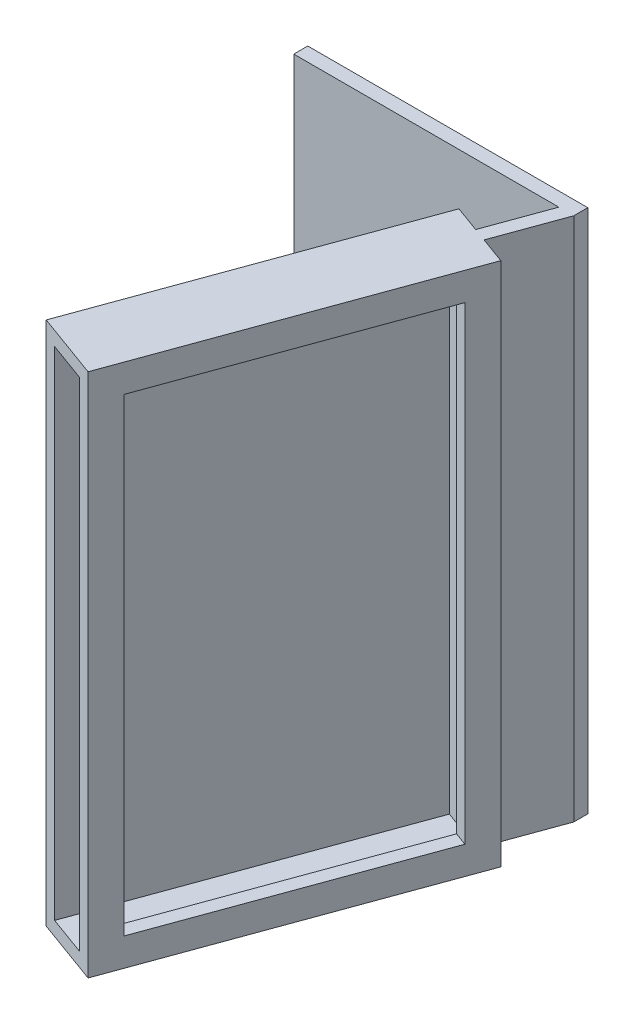
ISO-10303-21;
HEADER;
FILE_DESCRIPTION(('STEP AP214'),'2;1');
FILE_NAME('part.step','',(''),(''),'','','');
FILE_SCHEMA(('AUTOMOTIVE_DESIGN { 1 0 10303 214 1 1 1 1 }'));
ENDSEC;
DATA;
#1=APPLICATION_CONTEXT('core data for automotive mechanical design processes');
#2=APPLICATION_PROTOCOL_DEFINITION('international standard','automotive_design',2000,#1);
#3=PRODUCT_CONTEXT('',#1,'mechanical');
#4=PRODUCT('Part','Part','',(#3));
#5=PRODUCT_RELATED_PRODUCT_CATEGORY('part','',(#4));
#6=PRODUCT_DEFINITION_FORMATION('','',#4);
#7=PRODUCT_DEFINITION_CONTEXT('part definition',#1,'design');
#8=PRODUCT_DEFINITION('design','',#6,#7);
#9=PRODUCT_DEFINITION_SHAPE('','',#8);
#10=(LENGTH_UNIT() NAMED_UNIT(*) SI_UNIT(.MILLI.,.METRE.));
#11=(NAMED_UNIT(*) PLANE_ANGLE_UNIT() SI_UNIT($,.RADIAN.));
#12=(NAMED_UNIT(*) SI_UNIT($,.STERADIAN.) SOLID_ANGLE_UNIT());
#13=UNCERTAINTY_MEASURE_WITH_UNIT(LENGTH_MEASURE(1.E-05),#10,'distance_accuracy_value','');
#14=(GEOMETRIC_REPRESENTATION_CONTEXT(3) GLOBAL_UNCERTAINTY_ASSIGNED_CONTEXT((#13)) GLOBAL_UNIT_ASSIGNED_CONTEXT((#10,
#11,#12)) REPRESENTATION_CONTEXT('',''));
#15=CARTESIAN_POINT('',(0.,0.,0.));
#16=DIRECTION('',(0.,0.,1.));
#17=DIRECTION('',(1.,0.,0.));
#18=AXIS2_PLACEMENT_3D('',#15,#16,#17);
#19=CARTESIAN_POINT('',(0.,0.,2.54));
#20=DIRECTION('',(0.,1.,0.));
#21=DIRECTION('',(0.,0.,1.));
#22=AXIS2_PLACEMENT_3D('',#19,#20,#21);
#23=PLANE('',#22);
#24=DIRECTION('',(1.,0.,0.));
#25=VECTOR('',#24,1.);
#26=CARTESIAN_POINT('',(0.,0.,0.));
#27=LINE('',#26,#25);
#28=CARTESIAN_POINT('',(-50.8,0.,0.));
#29=VERTEX_POINT('',#28);
#30=CARTESIAN_POINT('',(0.,0.,0.));
#31=VERTEX_POINT('',#30);
#32=EDGE_CURVE('E288',#29,#31,#27,.T.);
#33=ORIENTED_EDGE('',*,*,#32,.T.);
#34=DIRECTION('',(0.,0.,-1.));
#35=VECTOR('',#34,1.);
#36=CARTESIAN_POINT('',(0.,0.,2.54));
#37=LINE('',#36,#35);
#38=CARTESIAN_POINT('',(0.,0.,2.54));
#39=VERTEX_POINT('',#38);
#40=EDGE_CURVE('E11',#39,#31,#37,.T.);
#41=ORIENTED_EDGE('',*,*,#40,.F.);
#42=DIRECTION('',(-0.342020143325672,0.,0.939692620785907));
#43=VECTOR('',#42,1.);
#44=CARTESIAN_POINT('',(0.,0.,2.54));
#45=LINE('',#44,#43);
#46=CARTESIAN_POINT('',(-4.34365582023604,0.,14.474096283981));
#47=VERTEX_POINT('',#46);
#48=EDGE_CURVE('E275',#39,#47,#45,.T.);
#49=ORIENTED_EDGE('',*,*,#48,.T.);
#50=DIRECTION('',(0.939692620785908,0.,0.342020143325671));
#51=VECTOR('',#50,1.);
#52=CARTESIAN_POINT('',(-11.5041135906247,0.,11.8679027918394));
#53=LINE('',#52,#51);
#54=CARTESIAN_POINT('',(0.429982693356341,0.,16.2115586120754));
#55=VERTEX_POINT('',#54);
#56=EDGE_CURVE('E248',#47,#55,#53,.T.);
#57=ORIENTED_EDGE('',*,*,#56,.T.);
#58=DIRECTION('',(0.342020143325671,0.,-0.939692620785908));
#59=VECTOR('',#58,1.);
#60=CARTESIAN_POINT('',(-0.438748470690864,0.,18.5983778688716));
#61=LINE('',#60,#59);
#62=CARTESIAN_POINT('',(-19.5508340797293,0.,71.1084015183881));
#63=VERTEX_POINT('',#62);
#64=EDGE_CURVE('E263',#63,#55,#61,.T.);
#65=ORIENTED_EDGE('',*,*,#64,.F.);
#66=DIRECTION('',(0.939692620785907,0.,0.342020143325671));
#67=VECTOR('',#66,1.);
#68=CARTESIAN_POINT('',(-31.4849303637104,0.,66.7647456981521));
#69=LINE('',#68,#67);
#70=CARTESIAN_POINT('',(-31.4849303637104,0.,66.7647456981521));
#71=VERTEX_POINT('',#70);
#72=EDGE_CURVE('E240',#71,#63,#69,.T.);
#73=ORIENTED_EDGE('',*,*,#72,.F.);
#74=DIRECTION('',(0.342020143325671,0.,-0.939692620785908));
#75=VECTOR('',#74,1.);
#76=CARTESIAN_POINT('',(-12.3728447546719,0.,14.2547220486356));
#77=LINE('',#76,#75);
#78=CARTESIAN_POINT('',(-11.5041135906247,0.,11.8679027918394));
#79=VERTEX_POINT('',#78);
#80=EDGE_CURVE('E270',#71,#79,#77,.T.);
#81=ORIENTED_EDGE('',*,*,#80,.T.);
#82=CARTESIAN_POINT('',(-6.73047507703225,0.,13.6053651199338));
#83=VERTEX_POINT('',#82);
#84=EDGE_CURVE('E249',#79,#83,#53,.T.);
#85=ORIENTED_EDGE('',*,*,#84,.T.);
#86=DIRECTION('',(0.342020143325673,0.,-0.939692620785907));
#87=VECTOR('',#86,1.);
#88=CARTESIAN_POINT('',(-6.73047507703224,0.,13.6053651199338));
#89=LINE('',#88,#87);
#90=CARTESIAN_POINT('',(-2.70301154208881,0.,2.54));
#91=VERTEX_POINT('',#90);
#92=EDGE_CURVE('E273',#83,#91,#89,.T.);
#93=ORIENTED_EDGE('',*,*,#92,.T.);
#94=DIRECTION('',(1.,0.,0.));
#95=VECTOR('',#94,1.);
#96=CARTESIAN_POINT('',(0.,0.,2.54));
#97=LINE('',#96,#95);
#98=CARTESIAN_POINT('',(-50.8,0.,2.54));
#99=VERTEX_POINT('',#98);
#100=EDGE_CURVE('E293',#99,#91,#97,.T.);
#101=ORIENTED_EDGE('',*,*,#100,.F.);
#102=DIRECTION('',(0.,0.,-1.));
#103=VECTOR('',#102,1.);
#104=CARTESIAN_POINT('',(-50.8,0.,2.54));
#105=LINE('',#104,#103);
#106=EDGE_CURVE('E301',#99,#29,#105,.T.);
#107=ORIENTED_EDGE('',*,*,#106,.T.);
#108=EDGE_LOOP('',(#33,#41,#49,#57,#65,#73,#81,#85,#93,#101,#107));
#109=FACE_BOUND('',#108,.T.);
#110=ADVANCED_FACE('F39',(#109),#23,.F.);
#111=CARTESIAN_POINT('',(0.,0.,2.54));
#112=DIRECTION('',(-1.,0.,0.));
#113=DIRECTION('',(0.,0.,1.));
#114=AXIS2_PLACEMENT_3D('',#111,#112,#113);
#115=PLANE('',#114);
#116=DIRECTION('',(0.,1.,0.));
#117=VECTOR('',#116,1.);
#118=CARTESIAN_POINT('',(0.,0.,0.));
#119=LINE('',#118,#117);
#120=CARTESIAN_POINT('',(0.,95.25,0.));
#121=VERTEX_POINT('',#120);
#122=EDGE_CURVE('E302',#31,#121,#119,.T.);
#123=ORIENTED_EDGE('',*,*,#122,.T.);
#124=DIRECTION('',(0.,0.,-1.));
#125=VECTOR('',#124,1.);
#126=CARTESIAN_POINT('',(0.,95.25,2.54));
#127=LINE('',#126,#125);
#128=CARTESIAN_POINT('',(0.,95.25,2.54));
#129=VERTEX_POINT('',#128);
#130=EDGE_CURVE('E46',#129,#121,#127,.T.);
#131=ORIENTED_EDGE('',*,*,#130,.F.);
#132=DIRECTION('',(0.,1.,0.));
#133=VECTOR('',#132,1.);
#134=CARTESIAN_POINT('',(0.,0.,2.54));
#135=LINE('',#134,#133);
#136=EDGE_CURVE('E295',#39,#129,#135,.T.);
#137=ORIENTED_EDGE('',*,*,#136,.F.);
#138=ORIENTED_EDGE('',*,*,#40,.T.);
#139=EDGE_LOOP('',(#123,#131,#137,#138));
#140=FACE_BOUND('',#139,.T.);
#141=ADVANCED_FACE('F363',(#140),#115,.F.);
#142=CARTESIAN_POINT('',(0.,95.25,2.54));
#143=DIRECTION('',(0.,-1.,0.));
#144=DIRECTION('',(0.,0.,-1.));
#145=AXIS2_PLACEMENT_3D('',#142,#143,#144);
#146=PLANE('',#145);
#147=DIRECTION('',(-1.,0.,0.));
#148=VECTOR('',#147,1.);
#149=CARTESIAN_POINT('',(0.,95.25,0.));
#150=LINE('',#149,#148);
#151=CARTESIAN_POINT('',(-50.8,95.25,0.));
#152=VERTEX_POINT('',#151);
#153=EDGE_CURVE('E306',#121,#152,#150,.T.);
#154=ORIENTED_EDGE('',*,*,#153,.T.);
#155=DIRECTION('',(0.,0.,-1.));
#156=VECTOR('',#155,1.);
#157=CARTESIAN_POINT('',(-50.8,95.25,2.54));
#158=LINE('',#157,#156);
#159=CARTESIAN_POINT('',(-50.8,95.25,2.54));
#160=VERTEX_POINT('',#159);
#161=EDGE_CURVE('E311',#160,#152,#158,.T.);
#162=ORIENTED_EDGE('',*,*,#161,.F.);
#163=DIRECTION('',(-1.,0.,0.));
#164=VECTOR('',#163,1.);
#165=CARTESIAN_POINT('',(0.,95.25,2.54));
#166=LINE('',#165,#164);
#167=CARTESIAN_POINT('',(-2.70301154208881,95.25,2.54));
#168=VERTEX_POINT('',#167);
#169=EDGE_CURVE('E300',#168,#160,#166,.T.);
#170=ORIENTED_EDGE('',*,*,#169,.F.);
#171=DIRECTION('',(-0.342020143325673,0.,0.939692620785907));
#172=VECTOR('',#171,1.);
#173=CARTESIAN_POINT('',(-6.73047507703224,95.25,13.6053651199338));
#174=LINE('',#173,#172);
#175=CARTESIAN_POINT('',(-6.73047507703224,95.25,13.6053651199338));
#176=VERTEX_POINT('',#175);
#177=EDGE_CURVE('E272',#168,#176,#174,.T.);
#178=ORIENTED_EDGE('',*,*,#177,.T.);
#179=DIRECTION('',(-0.939692620785908,0.,-0.342020143325671));
#180=VECTOR('',#179,1.);
#181=CARTESIAN_POINT('',(-11.5041135906247,95.25,11.8679027918394));
#182=LINE('',#181,#180);
#183=CARTESIAN_POINT('',(-11.5041135906247,95.25,11.8679027918394));
#184=VERTEX_POINT('',#183);
#185=EDGE_CURVE('E253',#176,#184,#182,.T.);
#186=ORIENTED_EDGE('',*,*,#185,.T.);
#187=DIRECTION('',(0.342020143325671,0.,-0.939692620785908));
#188=VECTOR('',#187,1.);
#189=CARTESIAN_POINT('',(-12.3728447546719,95.25,14.2547220486356));
#190=LINE('',#189,#188);
#191=CARTESIAN_POINT('',(-31.4849303637104,95.25,66.7647456981521));
#192=VERTEX_POINT('',#191);
#193=EDGE_CURVE('E256',#192,#184,#190,.T.);
#194=ORIENTED_EDGE('',*,*,#193,.F.);
#195=DIRECTION('',(-0.939692620785907,0.,-0.342020143325671));
#196=VECTOR('',#195,1.);
#197=CARTESIAN_POINT('',(-31.4849303637104,95.25,66.7647456981521));
#198=LINE('',#197,#196);
#199=CARTESIAN_POINT('',(-19.5508340797294,95.25,71.1084015183881));
#200=VERTEX_POINT('',#199);
#201=EDGE_CURVE('E243',#200,#192,#198,.T.);
#202=ORIENTED_EDGE('',*,*,#201,.F.);
#203=DIRECTION('',(0.342020143325671,0.,-0.939692620785908));
#204=VECTOR('',#203,1.);
#205=CARTESIAN_POINT('',(-0.438748470690838,95.25,18.5983778688716));
#206=LINE('',#205,#204);
#207=CARTESIAN_POINT('',(0.429982693356366,95.25,16.2115586120754));
#208=VERTEX_POINT('',#207);
#209=EDGE_CURVE('E265',#200,#208,#206,.T.);
#210=ORIENTED_EDGE('',*,*,#209,.T.);
#211=CARTESIAN_POINT('',(-4.34365582023604,95.25,14.474096283981));
#212=VERTEX_POINT('',#211);
#213=EDGE_CURVE('E257',#208,#212,#182,.T.);
#214=ORIENTED_EDGE('',*,*,#213,.T.);
#215=DIRECTION('',(0.342020143325673,0.,-0.939692620785907));
#216=VECTOR('',#215,1.);
#217=CARTESIAN_POINT('',(0.,95.25,2.54));
#218=LINE('',#217,#216);
#219=EDGE_CURVE('E276',#212,#129,#218,.T.);
#220=ORIENTED_EDGE('',*,*,#219,.T.);
#221=ORIENTED_EDGE('',*,*,#130,.T.);
#222=EDGE_LOOP('',(#154,#162,#170,#178,#186,#194,#202,#210,#214,#220,#221));
#223=FACE_BOUND('',#222,.T.);
#224=ADVANCED_FACE('F320',(#223),#146,.F.);
#225=CARTESIAN_POINT('',(-50.8,0.,2.54));
#226=DIRECTION('',(1.,0.,0.));
#227=DIRECTION('',(0.,0.,-1.));
#228=AXIS2_PLACEMENT_3D('',#225,#226,#227);
#229=PLANE('',#228);
#230=DIRECTION('',(0.,-1.,0.));
#231=VECTOR('',#230,1.);
#232=CARTESIAN_POINT('',(-50.8,0.,0.));
#233=LINE('',#232,#231);
#234=EDGE_CURVE('E294',#152,#29,#233,.T.);
#235=ORIENTED_EDGE('',*,*,#234,.T.);
#236=ORIENTED_EDGE('',*,*,#106,.F.);
#237=DIRECTION('',(0.,-1.,0.));
#238=VECTOR('',#237,1.);
#239=CARTESIAN_POINT('',(-50.8,0.,2.54));
#240=LINE('',#239,#238);
#241=EDGE_CURVE('E299',#160,#99,#240,.T.);
#242=ORIENTED_EDGE('',*,*,#241,.F.);
#243=ORIENTED_EDGE('',*,*,#161,.T.);
#244=EDGE_LOOP('',(#235,#236,#242,#243));
#245=FACE_BOUND('',#244,.T.);
#246=ADVANCED_FACE('F329',(#245),#229,.F.);
#247=CARTESIAN_POINT('',(0.,0.,2.54));
#248=DIRECTION('',(0.,0.,-1.));
#249=DIRECTION('',(-1.,0.,0.));
#250=AXIS2_PLACEMENT_3D('',#247,#248,#249);
#251=PLANE('',#250);
#252=ORIENTED_EDGE('',*,*,#100,.T.);
#253=DIRECTION('',(0.,1.,0.));
#254=VECTOR('',#253,1.);
#255=CARTESIAN_POINT('',(-2.70301154208881,-13.7011659678248,2.54));
#256=LINE('',#255,#254);
#257=EDGE_CURVE('E285',#91,#168,#256,.T.);
#258=ORIENTED_EDGE('',*,*,#257,.T.);
#259=ORIENTED_EDGE('',*,*,#169,.T.);
#260=ORIENTED_EDGE('',*,*,#241,.T.);
#261=EDGE_LOOP('',(#252,#258,#259,#260));
#262=FACE_BOUND('',#261,.T.);
#263=ADVANCED_FACE('F337',(#262),#251,.F.);
#264=CARTESIAN_POINT('',(0.,0.,0.));
#265=DIRECTION('',(0.,0.,-1.));
#266=DIRECTION('',(-1.,0.,0.));
#267=AXIS2_PLACEMENT_3D('',#264,#265,#266);
#268=PLANE('',#267);
#269=ORIENTED_EDGE('',*,*,#32,.F.);
#270=ORIENTED_EDGE('',*,*,#234,.F.);
#271=ORIENTED_EDGE('',*,*,#153,.F.);
#272=ORIENTED_EDGE('',*,*,#122,.F.);
#273=EDGE_LOOP('',(#269,#270,#271,#272));
#274=FACE_BOUND('',#273,.T.);
#275=ADVANCED_FACE('F323',(#274),#268,.T.);
#276=CARTESIAN_POINT('',(0.,-13.7011659678248,2.54));
#277=DIRECTION('',(0.939692620785907,0.,0.342020143325672));
#278=DIRECTION('',(0.342020143325672,0.,-0.939692620785907));
#279=AXIS2_PLACEMENT_3D('',#276,#277,#278);
#280=PLANE('',#279);
#281=ORIENTED_EDGE('',*,*,#48,.F.);
#282=ORIENTED_EDGE('',*,*,#136,.T.);
#283=ORIENTED_EDGE('',*,*,#219,.F.);
#284=DIRECTION('',(0.,1.,0.));
#285=VECTOR('',#284,1.);
#286=CARTESIAN_POINT('',(-4.34365582023604,-13.7011659678248,14.474096283981));
#287=LINE('',#286,#285);
#288=EDGE_CURVE('E277',#47,#212,#287,.T.);
#289=ORIENTED_EDGE('',*,*,#288,.F.);
#290=EDGE_LOOP('',(#281,#282,#283,#289));
#291=FACE_BOUND('',#290,.T.);
#292=ADVANCED_FACE('F359',(#291),#280,.T.);
#293=CARTESIAN_POINT('',(-6.73047507703224,-13.7011659678248,13.6053651199338));
#294=DIRECTION('',(-0.939692620785907,0.,-0.342020143325673));
#295=DIRECTION('',(-0.342020143325673,0.,0.939692620785907));
#296=AXIS2_PLACEMENT_3D('',#293,#294,#295);
#297=PLANE('',#296);
#298=ORIENTED_EDGE('',*,*,#92,.F.);
#299=DIRECTION('',(0.,1.,0.));
#300=VECTOR('',#299,1.);
#301=CARTESIAN_POINT('',(-6.73047507703224,-13.7011659678248,13.6053651199338));
#302=LINE('',#301,#300);
#303=EDGE_CURVE('E281',#83,#176,#302,.T.);
#304=ORIENTED_EDGE('',*,*,#303,.T.);
#305=ORIENTED_EDGE('',*,*,#177,.F.);
#306=ORIENTED_EDGE('',*,*,#257,.F.);
#307=EDGE_LOOP('',(#298,#304,#305,#306));
#308=FACE_BOUND('',#307,.T.);
#309=ADVANCED_FACE('F339',(#308),#297,.T.);
#310=CARTESIAN_POINT('',(-5.15999608453793,0.,14.1769727267421));
#311=DIRECTION('',(-0.342020143325671,0.,0.939692620785908));
#312=DIRECTION('',(0.939692620785908,0.,0.342020143325671));
#313=AXIS2_PLACEMENT_3D('',#310,#311,#312);
#314=PLANE('',#313);
#315=ORIENTED_EDGE('',*,*,#56,.F.);
#316=ORIENTED_EDGE('',*,*,#288,.T.);
#317=ORIENTED_EDGE('',*,*,#213,.F.);
#318=DIRECTION('',(0.,1.,0.));
#319=VECTOR('',#318,1.);
#320=CARTESIAN_POINT('',(0.429982693356366,95.25,16.2115586120754));
#321=LINE('',#320,#319);
#322=EDGE_CURVE('E254',#55,#208,#321,.T.);
#323=ORIENTED_EDGE('',*,*,#322,.F.);
#324=EDGE_LOOP('',(#315,#316,#317,#323));
#325=FACE_BOUND('',#324,.T.);
#326=ADVANCED_FACE('F357',(#325),#314,.F.);
#327=CARTESIAN_POINT('',(-12.3728447546719,95.25,14.2547220486356));
#328=DIRECTION('',(0.939692620785908,0.,0.342020143325671));
#329=DIRECTION('',(0.342020143325671,0.,-0.939692620785908));
#330=AXIS2_PLACEMENT_3D('',#327,#328,#329);
#331=PLANE('',#330);
#332=DIRECTION('',(0.,-1.,0.));
#333=VECTOR('',#332,1.);
#334=CARTESIAN_POINT('',(-11.5041135906247,95.25,11.8679027918394));
#335=LINE('',#334,#333);
#336=EDGE_CURVE('E246',#184,#79,#335,.T.);
#337=ORIENTED_EDGE('',*,*,#336,.T.);
#338=ORIENTED_EDGE('',*,*,#80,.F.);
#339=DIRECTION('',(0.,-1.,0.));
#340=VECTOR('',#339,1.);
#341=CARTESIAN_POINT('',(-31.4849303637104,95.25,66.7647456981521));
#342=LINE('',#341,#340);
#343=EDGE_CURVE('E234',#192,#71,#342,.T.);
#344=ORIENTED_EDGE('',*,*,#343,.F.);
#345=ORIENTED_EDGE('',*,*,#193,.T.);
#346=EDGE_LOOP('',(#337,#338,#344,#345));
#347=FACE_BOUND('',#346,.T.);
#348=ADVANCED_FACE('F347',(#347),#331,.F.);
#349=CARTESIAN_POINT('',(-0.438748470690838,95.25,18.5983778688716));
#350=DIRECTION('',(-0.939692620785908,0.,-0.342020143325671));
#351=DIRECTION('',(-0.342020143325671,0.,0.939692620785908));
#352=AXIS2_PLACEMENT_3D('',#349,#350,#351);
#353=PLANE('',#352);
#354=DIRECTION('',(-0.342020143325671,0.,0.939692620785908));
#355=VECTOR('',#354,1.);
#356=CARTESIAN_POINT('',(-17.813371751635,90.17,66.3347630047958));
#357=LINE('',#356,#355);
#358=CARTESIAN_POINT('',(-1.30747963473808,90.17,20.9851971256678));
#359=VERTEX_POINT('',#358);
#360=CARTESIAN_POINT('',(-17.813371751635,90.17,66.3347630047958));
#361=VERTEX_POINT('',#360);
#362=EDGE_CURVE('E183',#359,#361,#357,.T.);
#363=ORIENTED_EDGE('',*,*,#362,.F.);
#364=DIRECTION('',(0.,1.,0.));
#365=VECTOR('',#364,1.);
#366=CARTESIAN_POINT('',(-1.30747963473807,5.08000000000001,20.9851971256678));
#367=LINE('',#366,#365);
#368=CARTESIAN_POINT('',(-1.30747963473807,5.08000000000001,20.9851971256678));
#369=VERTEX_POINT('',#368);
#370=EDGE_CURVE('E197',#369,#359,#367,.T.);
#371=ORIENTED_EDGE('',*,*,#370,.F.);
#372=DIRECTION('',(0.342020143325671,0.,-0.939692620785908));
#373=VECTOR('',#372,1.);
#374=CARTESIAN_POINT('',(-17.813371751635,5.08,66.3347630047958));
#375=LINE('',#374,#373);
#376=CARTESIAN_POINT('',(-17.813371751635,5.07999999999999,66.3347630047958));
#377=VERTEX_POINT('',#376);
#378=EDGE_CURVE('E191',#377,#369,#375,.T.);
#379=ORIENTED_EDGE('',*,*,#378,.F.);
#380=DIRECTION('',(0.,-1.,0.));
#381=VECTOR('',#380,1.);
#382=CARTESIAN_POINT('',(-17.813371751635,5.08,66.3347630047958));
#383=LINE('',#382,#381);
#384=EDGE_CURVE('E52',#361,#377,#383,.T.);
#385=ORIENTED_EDGE('',*,*,#384,.F.);
#386=EDGE_LOOP('',(#363,#371,#379,#385));
#387=FACE_BOUND('',#386,.T.);
#388=ORIENTED_EDGE('',*,*,#322,.T.);
#389=ORIENTED_EDGE('',*,*,#209,.F.);
#390=DIRECTION('',(0.,1.,0.));
#391=VECTOR('',#390,1.);
#392=CARTESIAN_POINT('',(-19.5508340797294,95.25,71.1084015183881));
#393=LINE('',#392,#391);
#394=EDGE_CURVE('E239',#63,#200,#393,.T.);
#395=ORIENTED_EDGE('',*,*,#394,.F.);
#396=ORIENTED_EDGE('',*,*,#64,.T.);
#397=EDGE_LOOP('',(#388,#389,#395,#396));
#398=FACE_BOUND('',#397,.T.);
#399=ADVANCED_FACE('F355',(#387,#398),#353,.F.);
#400=ORIENTED_EDGE('',*,*,#303,.F.);
#401=ORIENTED_EDGE('',*,*,#84,.F.);
#402=ORIENTED_EDGE('',*,*,#336,.F.);
#403=ORIENTED_EDGE('',*,*,#185,.F.);
#404=EDGE_LOOP('',(#400,#401,#402,#403));
#405=FACE_BOUND('',#404,.T.);
#406=ADVANCED_FACE('F342',(#405),#314,.F.);
#407=CARTESIAN_POINT('',(-25.1408128576236,0.,69.0738156330549));
#408=DIRECTION('',(-0.342020143325671,0.,0.939692620785908));
#409=DIRECTION('',(0.939692620785908,0.,0.342020143325671));
#410=AXIS2_PLACEMENT_3D('',#407,#408,#409);
#411=PLANE('',#410);
#412=ORIENTED_EDGE('',*,*,#343,.T.);
#413=ORIENTED_EDGE('',*,*,#72,.T.);
#414=ORIENTED_EDGE('',*,*,#394,.T.);
#415=ORIENTED_EDGE('',*,*,#201,.T.);
#416=EDGE_LOOP('',(#412,#413,#414,#415));
#417=FACE_BOUND('',#416,.T.);
#418=DIRECTION('',(0.939692620785908,0.,0.342020143325671));
#419=VECTOR('',#418,1.);
#420=CARTESIAN_POINT('',(-29.0981111069142,2.54,67.6334768621993));
#421=LINE('',#420,#419);
#422=CARTESIAN_POINT('',(-29.0981111069142,2.54,67.6334768621993));
#423=VERTEX_POINT('',#422);
#424=CARTESIAN_POINT('',(-21.9376533365256,2.54,70.2396703543409));
#425=VERTEX_POINT('',#424);
#426=EDGE_CURVE('E206',#423,#425,#421,.T.);
#427=ORIENTED_EDGE('',*,*,#426,.F.);
#428=DIRECTION('',(0.,-1.,0.));
#429=VECTOR('',#428,1.);
#430=CARTESIAN_POINT('',(-29.0981111069142,92.71,67.6334768621993));
#431=LINE('',#430,#429);
#432=CARTESIAN_POINT('',(-29.0981111069142,92.71,67.6334768621993));
#433=VERTEX_POINT('',#432);
#434=EDGE_CURVE('E207',#433,#423,#431,.T.);
#435=ORIENTED_EDGE('',*,*,#434,.F.);
#436=DIRECTION('',(-0.939692620785908,0.,-0.342020143325671));
#437=VECTOR('',#436,1.);
#438=CARTESIAN_POINT('',(-29.0981111069142,92.71,67.6334768621993));
#439=LINE('',#438,#437);
#440=CARTESIAN_POINT('',(-21.9376533365256,92.71,70.2396703543409));
#441=VERTEX_POINT('',#440);
#442=EDGE_CURVE('E211',#441,#433,#439,.T.);
#443=ORIENTED_EDGE('',*,*,#442,.F.);
#444=DIRECTION('',(0.,1.,0.));
#445=VECTOR('',#444,1.);
#446=CARTESIAN_POINT('',(-21.9376533365256,92.71,70.2396703543409));
#447=LINE('',#446,#445);
#448=EDGE_CURVE('E212',#425,#441,#447,.T.);
#449=ORIENTED_EDGE('',*,*,#448,.F.);
#450=EDGE_LOOP('',(#427,#435,#443,#449));
#451=FACE_BOUND('',#450,.T.);
#452=ADVANCED_FACE('F346',(#417,#451),#411,.T.);
#453=CARTESIAN_POINT('',(-29.0981111069142,92.71,67.6334768621993));
#454=DIRECTION('',(0.939692620785908,0.,0.342020143325671));
#455=DIRECTION('',(0.342020143325671,0.,-0.939692620785908));
#456=AXIS2_PLACEMENT_3D('',#453,#454,#455);
#457=PLANE('',#456);
#458=DIRECTION('',(0.,-1.,0.));
#459=VECTOR('',#458,1.);
#460=CARTESIAN_POINT('',(-9.98602549787566,92.71,15.1234532126828));
#461=LINE('',#460,#459);
#462=CARTESIAN_POINT('',(-9.98602549787565,92.71,15.1234532126828));
#463=VERTEX_POINT('',#462);
#464=CARTESIAN_POINT('',(-9.98602549787567,2.54,15.1234532126828));
#465=VERTEX_POINT('',#464);
#466=EDGE_CURVE('E203',#463,#465,#461,.T.);
#467=ORIENTED_EDGE('',*,*,#466,.F.);
#468=DIRECTION('',(0.342020143325671,0.,-0.939692620785908));
#469=VECTOR('',#468,1.);
#470=CARTESIAN_POINT('',(-29.0981111069142,92.71,67.6334768621993));
#471=LINE('',#470,#469);
#472=EDGE_CURVE('E217',#433,#463,#471,.T.);
#473=ORIENTED_EDGE('',*,*,#472,.F.);
#474=ORIENTED_EDGE('',*,*,#434,.T.);
#475=DIRECTION('',(0.342020143325671,0.,-0.939692620785908));
#476=VECTOR('',#475,1.);
#477=CARTESIAN_POINT('',(-29.0981111069142,2.54,67.6334768621993));
#478=LINE('',#477,#476);
#479=EDGE_CURVE('E233',#423,#465,#478,.T.);
#480=ORIENTED_EDGE('',*,*,#479,.T.);
#481=EDGE_LOOP('',(#467,#473,#474,#480));
#482=FACE_BOUND('',#481,.T.);
#483=ADVANCED_FACE('F391',(#482),#457,.T.);
#484=CARTESIAN_POINT('',(-29.0981111069142,2.54,67.6334768621993));
#485=DIRECTION('',(0.,1.,0.));
#486=DIRECTION('',(0.,0.,1.));
#487=AXIS2_PLACEMENT_3D('',#484,#485,#486);
#488=PLANE('',#487);
#489=DIRECTION('',(0.939692620785908,0.,0.342020143325671));
#490=VECTOR('',#489,1.);
#491=CARTESIAN_POINT('',(-9.98602549787567,2.54,15.1234532126828));
#492=LINE('',#491,#490);
#493=CARTESIAN_POINT('',(-2.82556772748705,2.54,17.7296467048244));
#494=VERTEX_POINT('',#493);
#495=EDGE_CURVE('E219',#465,#494,#492,.T.);
#496=ORIENTED_EDGE('',*,*,#495,.F.);
#497=ORIENTED_EDGE('',*,*,#479,.F.);
#498=ORIENTED_EDGE('',*,*,#426,.T.);
#499=DIRECTION('',(0.342020143325671,0.,-0.939692620785908));
#500=VECTOR('',#499,1.);
#501=CARTESIAN_POINT('',(-21.9376533365256,2.54,70.2396703543409));
#502=LINE('',#501,#500);
#503=EDGE_CURVE('E226',#425,#494,#502,.T.);
#504=ORIENTED_EDGE('',*,*,#503,.T.);
#505=EDGE_LOOP('',(#496,#497,#498,#504));
#506=FACE_BOUND('',#505,.T.);
#507=ADVANCED_FACE('F399',(#506),#488,.T.);
#508=CARTESIAN_POINT('',(-21.9376533365256,92.71,70.2396703543409));
#509=DIRECTION('',(-0.939692620785908,0.,-0.342020143325671));
#510=DIRECTION('',(-0.342020143325671,0.,0.939692620785908));
#511=AXIS2_PLACEMENT_3D('',#508,#509,#510);
#512=PLANE('',#511);
#513=DIRECTION('',(0.,1.,0.));
#514=VECTOR('',#513,1.);
#515=CARTESIAN_POINT('',(-3.69429889153424,5.08000000000002,20.1164659616206));
#516=LINE('',#515,#514);
#517=CARTESIAN_POINT('',(-3.69429889153425,5.08000000000001,20.1164659616206));
#518=VERTEX_POINT('',#517);
#519=CARTESIAN_POINT('',(-3.69429889153424,90.17,20.1164659616206));
#520=VERTEX_POINT('',#519);
#521=EDGE_CURVE('E188',#518,#520,#516,.T.);
#522=ORIENTED_EDGE('',*,*,#521,.T.);
#523=DIRECTION('',(-0.342020143325671,0.,0.939692620785908));
#524=VECTOR('',#523,1.);
#525=CARTESIAN_POINT('',(-20.2001910084312,90.17,65.4660318407486));
#526=LINE('',#525,#524);
#527=CARTESIAN_POINT('',(-20.2001910084312,90.17,65.4660318407486));
#528=VERTEX_POINT('',#527);
#529=EDGE_CURVE('E178',#520,#528,#526,.T.);
#530=ORIENTED_EDGE('',*,*,#529,.T.);
#531=DIRECTION('',(0.,-1.,0.));
#532=VECTOR('',#531,1.);
#533=CARTESIAN_POINT('',(-20.2001910084311,5.08000000000001,65.4660318407486));
#534=LINE('',#533,#532);
#535=CARTESIAN_POINT('',(-20.2001910084311,5.07999999999999,65.4660318407486));
#536=VERTEX_POINT('',#535);
#537=EDGE_CURVE('E166',#528,#536,#534,.T.);
#538=ORIENTED_EDGE('',*,*,#537,.T.);
#539=DIRECTION('',(0.342020143325671,0.,-0.939692620785908));
#540=VECTOR('',#539,1.);
#541=CARTESIAN_POINT('',(-20.2001910084311,5.08,65.4660318407486));
#542=LINE('',#541,#540);
#543=EDGE_CURVE('E180',#536,#518,#542,.T.);
#544=ORIENTED_EDGE('',*,*,#543,.T.);
#545=EDGE_LOOP('',(#522,#530,#538,#544));
#546=FACE_BOUND('',#545,.T.);
#547=DIRECTION('',(0.,1.,0.));
#548=VECTOR('',#547,1.);
#549=CARTESIAN_POINT('',(-2.82556772748708,92.71,17.7296467048244));
#550=LINE('',#549,#548);
#551=CARTESIAN_POINT('',(-2.82556772748708,92.71,17.7296467048244));
#552=VERTEX_POINT('',#551);
#553=EDGE_CURVE('E218',#494,#552,#550,.T.);
#554=ORIENTED_EDGE('',*,*,#553,.F.);
#555=ORIENTED_EDGE('',*,*,#503,.F.);
#556=ORIENTED_EDGE('',*,*,#448,.T.);
#557=DIRECTION('',(0.342020143325671,0.,-0.939692620785908));
#558=VECTOR('',#557,1.);
#559=CARTESIAN_POINT('',(-21.9376533365256,92.71,70.2396703543409));
#560=LINE('',#559,#558);
#561=EDGE_CURVE('E223',#441,#552,#560,.T.);
#562=ORIENTED_EDGE('',*,*,#561,.T.);
#563=EDGE_LOOP('',(#554,#555,#556,#562));
#564=FACE_BOUND('',#563,.T.);
#565=ADVANCED_FACE('F189',(#546,#564),#512,.T.);
#566=CARTESIAN_POINT('',(-29.0981111069142,92.71,67.6334768621993));
#567=DIRECTION('',(0.,-1.,0.));
#568=DIRECTION('',(0.,0.,-1.));
#569=AXIS2_PLACEMENT_3D('',#566,#567,#568);
#570=PLANE('',#569);
#571=DIRECTION('',(-0.939692620785908,0.,-0.342020143325671));
#572=VECTOR('',#571,1.);
#573=CARTESIAN_POINT('',(-9.98602549787566,92.71,15.1234532126828));
#574=LINE('',#573,#572);
#575=EDGE_CURVE('E209',#552,#463,#574,.T.);
#576=ORIENTED_EDGE('',*,*,#575,.F.);
#577=ORIENTED_EDGE('',*,*,#561,.F.);
#578=ORIENTED_EDGE('',*,*,#442,.T.);
#579=ORIENTED_EDGE('',*,*,#472,.T.);
#580=EDGE_LOOP('',(#576,#577,#578,#579));
#581=FACE_BOUND('',#580,.T.);
#582=ADVANCED_FACE('F388',(#581),#570,.T.);
#583=CARTESIAN_POINT('',(-6.02872724858514,0.,16.5637919835383));
#584=DIRECTION('',(-0.342020143325671,0.,0.939692620785908));
#585=DIRECTION('',(0.939692620785908,0.,0.342020143325671));
#586=AXIS2_PLACEMENT_3D('',#583,#584,#585);
#587=PLANE('',#586);
#588=ORIENTED_EDGE('',*,*,#466,.T.);
#589=ORIENTED_EDGE('',*,*,#495,.T.);
#590=ORIENTED_EDGE('',*,*,#553,.T.);
#591=ORIENTED_EDGE('',*,*,#575,.T.);
#592=EDGE_LOOP('',(#588,#589,#590,#591));
#593=FACE_BOUND('',#592,.T.);
#594=ADVANCED_FACE('F387',(#593),#587,.T.);
#595=CARTESIAN_POINT('',(-51.7561916838807,5.07999999999999,2.62336758271305));
#596=DIRECTION('',(0.342020143325671,0.,-0.939692620785908));
#597=DIRECTION('',(-0.939692620785908,0.,-0.342020143325671));
#598=AXIS2_PLACEMENT_3D('',#595,#596,#597);
#599=PLANE('',#598);
#600=DIRECTION('',(0.939692620785908,0.,0.342020143325671));
#601=VECTOR('',#600,1.);
#602=CARTESIAN_POINT('',(-51.7561916838807,5.07999999999999,2.62336758271305));
#603=LINE('',#602,#601);
#604=EDGE_CURVE('E62',#518,#369,#603,.T.);
#605=ORIENTED_EDGE('',*,*,#604,.T.);
#606=ORIENTED_EDGE('',*,*,#370,.T.);
#607=DIRECTION('',(0.939692620785908,0.,0.342020143325671));
#608=VECTOR('',#607,1.);
#609=CARTESIAN_POINT('',(-51.7561916838807,90.17,2.62336758271305));
#610=LINE('',#609,#608);
#611=EDGE_CURVE('E184',#520,#359,#610,.T.);
#612=ORIENTED_EDGE('',*,*,#611,.F.);
#613=ORIENTED_EDGE('',*,*,#521,.F.);
#614=EDGE_LOOP('',(#605,#606,#612,#613));
#615=FACE_BOUND('',#614,.T.);
#616=ADVANCED_FACE('F386',(#615),#599,.F.);
#617=CARTESIAN_POINT('',(-68.2620838007776,90.17,47.972933461841));
#618=DIRECTION('',(0.,1.,0.));
#619=DIRECTION('',(-1.,0.,0.));
#620=AXIS2_PLACEMENT_3D('',#617,#618,#619);
#621=PLANE('',#620);
#622=ORIENTED_EDGE('',*,*,#611,.T.);
#623=ORIENTED_EDGE('',*,*,#362,.T.);
#624=DIRECTION('',(0.939692620785908,0.,0.342020143325671));
#625=VECTOR('',#624,1.);
#626=CARTESIAN_POINT('',(-68.2620838007776,90.17,47.972933461841));
#627=LINE('',#626,#625);
#628=EDGE_CURVE('E171',#528,#361,#627,.T.);
#629=ORIENTED_EDGE('',*,*,#628,.F.);
#630=ORIENTED_EDGE('',*,*,#529,.F.);
#631=EDGE_LOOP('',(#622,#623,#629,#630));
#632=FACE_BOUND('',#631,.T.);
#633=ADVANCED_FACE('F181',(#632),#621,.F.);
#634=CARTESIAN_POINT('',(-68.2620838007776,5.07999999999999,47.972933461841));
#635=DIRECTION('',(-0.342020143325671,0.,0.939692620785908));
#636=DIRECTION('',(0.939692620785908,0.,0.342020143325671));
#637=AXIS2_PLACEMENT_3D('',#634,#635,#636);
#638=PLANE('',#637);
#639=ORIENTED_EDGE('',*,*,#628,.T.);
#640=ORIENTED_EDGE('',*,*,#384,.T.);
#641=DIRECTION('',(0.939692620785908,0.,0.342020143325671));
#642=VECTOR('',#641,1.);
#643=CARTESIAN_POINT('',(-68.2620838007776,5.07999999999999,47.972933461841));
#644=LINE('',#643,#642);
#645=EDGE_CURVE('E173',#536,#377,#644,.T.);
#646=ORIENTED_EDGE('',*,*,#645,.F.);
#647=ORIENTED_EDGE('',*,*,#537,.F.);
#648=EDGE_LOOP('',(#639,#640,#646,#647));
#649=FACE_BOUND('',#648,.T.);
#650=ADVANCED_FACE('F167',(#649),#638,.F.);
#651=CARTESIAN_POINT('',(-68.2620838007776,5.07999999999999,47.972933461841));
#652=DIRECTION('',(0.,-1.,0.));
#653=DIRECTION('',(1.,0.,0.));
#654=AXIS2_PLACEMENT_3D('',#651,#652,#653);
#655=PLANE('',#654);
#656=ORIENTED_EDGE('',*,*,#645,.T.);
#657=ORIENTED_EDGE('',*,*,#378,.T.);
#658=ORIENTED_EDGE('',*,*,#604,.F.);
#659=ORIENTED_EDGE('',*,*,#543,.F.);
#660=EDGE_LOOP('',(#656,#657,#658,#659));
#661=FACE_BOUND('',#660,.T.);
#662=ADVANCED_FACE('F410',(#661),#655,.F.);
#663=CLOSED_SHELL('',(#110,#141,#224,#246,#263,#275,#292,#309,#326,#348,#399,#406,#452,#483,
#507,#565,#582,#594,#616,#633,#650,#662));
#664=MANIFOLD_SOLID_BREP('B2',#663);
#665=ADVANCED_BREP_SHAPE_REPRESENTATION('',(#18,#664),#14);
#666=SHAPE_DEFINITION_REPRESENTATION(#9,#665);
ENDSEC;
END-ISO-10303-21;
